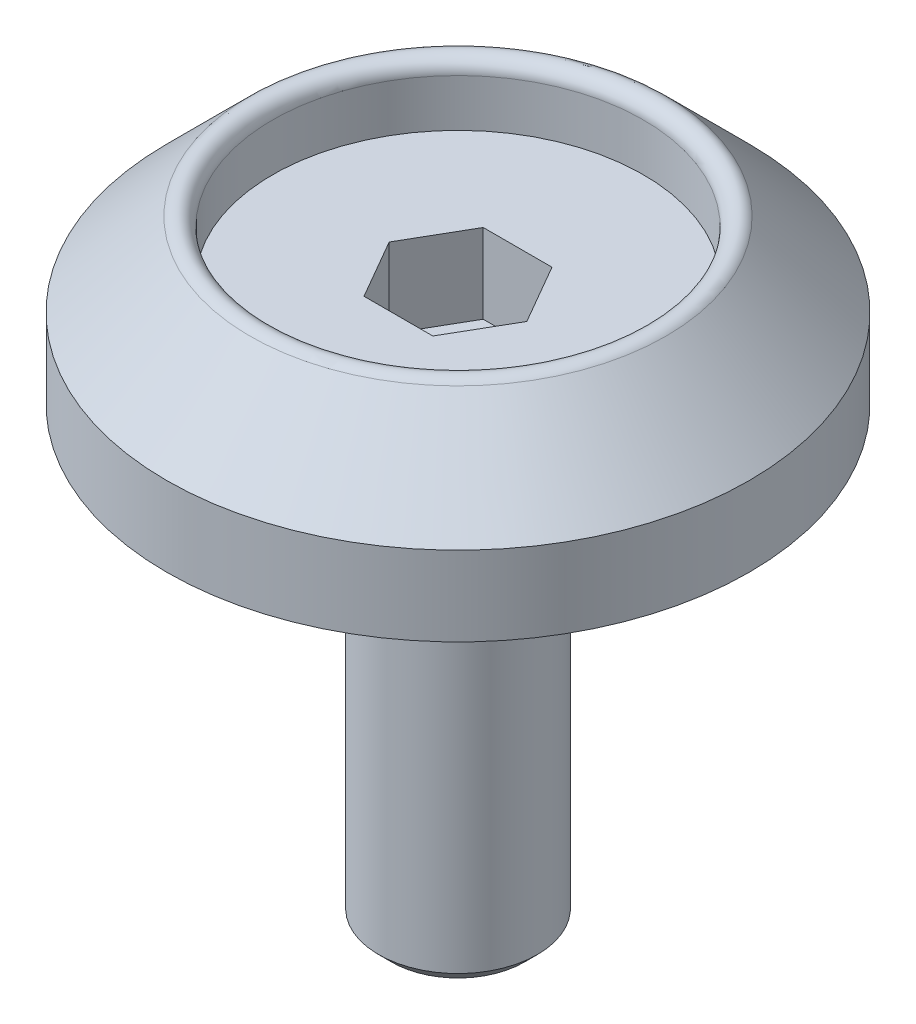
ISO-10303-21;
HEADER;
FILE_DESCRIPTION(('STEP AP214'),'2;1');
FILE_NAME('part.step','',(''),(''),'','','');
FILE_SCHEMA(('AUTOMOTIVE_DESIGN { 1 0 10303 214 1 1 1 1 }'));
ENDSEC;
DATA;
#1=APPLICATION_CONTEXT('core data for automotive mechanical design processes');
#2=APPLICATION_PROTOCOL_DEFINITION('international standard','automotive_design',2000,#1);
#3=PRODUCT_CONTEXT('',#1,'mechanical');
#4=PRODUCT('Part','Part','',(#3));
#5=PRODUCT_RELATED_PRODUCT_CATEGORY('part','',(#4));
#6=PRODUCT_DEFINITION_FORMATION('','',#4);
#7=PRODUCT_DEFINITION_CONTEXT('part definition',#1,'design');
#8=PRODUCT_DEFINITION('design','',#6,#7);
#9=PRODUCT_DEFINITION_SHAPE('','',#8);
#10=(LENGTH_UNIT() NAMED_UNIT(*) SI_UNIT(.MILLI.,.METRE.));
#11=(NAMED_UNIT(*) PLANE_ANGLE_UNIT() SI_UNIT($,.RADIAN.));
#12=(NAMED_UNIT(*) SI_UNIT($,.STERADIAN.) SOLID_ANGLE_UNIT());
#13=UNCERTAINTY_MEASURE_WITH_UNIT(LENGTH_MEASURE(1.E-05),#10,'distance_accuracy_value','');
#14=(GEOMETRIC_REPRESENTATION_CONTEXT(3) GLOBAL_UNCERTAINTY_ASSIGNED_CONTEXT((#13)) GLOBAL_UNIT_ASSIGNED_CONTEXT((#10,
#11,#12)) REPRESENTATION_CONTEXT('',''));
#15=CARTESIAN_POINT('',(0.,0.,0.));
#16=DIRECTION('',(0.,0.,1.));
#17=DIRECTION('',(1.,0.,0.));
#18=AXIS2_PLACEMENT_3D('',#15,#16,#17);
#19=CARTESIAN_POINT('',(0.,0.,0.));
#20=DIRECTION('',(0.,-1.,0.));
#21=DIRECTION('',(1.,0.,0.));
#22=AXIS2_PLACEMENT_3D('',#19,#20,#21);
#23=PLANE('',#22);
#24=CARTESIAN_POINT('',(0.,0.,0.));
#25=DIRECTION('',(0.,-1.,0.));
#26=DIRECTION('',(1.,0.,0.));
#27=AXIS2_PLACEMENT_3D('',#24,#25,#26);
#28=CIRCLE('',#27,1.25000000000002);
#29=CARTESIAN_POINT('',(1.25000000000001,0.,0.));
#30=VERTEX_POINT('',#29);
#31=EDGE_CURVE('E11',#30,#30,#28,.T.);
#32=ORIENTED_EDGE('',*,*,#31,.T.);
#33=EDGE_LOOP('',(#32));
#34=FACE_BOUND('',#33,.T.);
#35=ADVANCED_FACE('F32',(#34),#23,.T.);
#36=CARTESIAN_POINT('',(0.,0.,0.));
#37=DIRECTION('',(0.,1.,0.));
#38=DIRECTION('',(-1.,0.,0.));
#39=AXIS2_PLACEMENT_3D('',#36,#37,#38);
#40=CONICAL_SURFACE('',#39,1.25000000000002,0.785398163397451);
#41=CARTESIAN_POINT('',(0.,0.249999999999995,0.));
#42=DIRECTION('',(0.,-1.,0.));
#43=DIRECTION('',(1.,0.,0.));
#44=AXIS2_PLACEMENT_3D('',#41,#42,#43);
#45=CIRCLE('',#44,1.50000000000002);
#46=CARTESIAN_POINT('',(1.50000000000001,0.25,0.));
#47=VERTEX_POINT('',#46);
#48=EDGE_CURVE('E39',#47,#47,#45,.T.);
#49=ORIENTED_EDGE('',*,*,#48,.T.);
#50=EDGE_LOOP('',(#49));
#51=FACE_BOUND('',#50,.T.);
#52=ORIENTED_EDGE('',*,*,#31,.F.);
#53=EDGE_LOOP('',(#52));
#54=FACE_BOUND('',#53,.T.);
#55=ADVANCED_FACE('F160',(#51,#54),#40,.T.);
#56=CARTESIAN_POINT('',(0.,-3.12032212066735,0.));
#57=DIRECTION('',(0.,-1.,0.));
#58=DIRECTION('',(1.,0.,0.));
#59=AXIS2_PLACEMENT_3D('',#56,#57,#58);
#60=CYLINDRICAL_SURFACE('',#59,1.50000000000003);
#61=CARTESIAN_POINT('',(0.,8.49999999999999,0.));
#62=DIRECTION('',(0.,-1.,0.));
#63=DIRECTION('',(1.,0.,0.));
#64=AXIS2_PLACEMENT_3D('',#61,#62,#63);
#65=CIRCLE('',#64,1.50000000000005);
#66=CARTESIAN_POINT('',(1.5,8.5,0.));
#67=VERTEX_POINT('',#66);
#68=EDGE_CURVE('E155',#67,#67,#65,.T.);
#69=ORIENTED_EDGE('',*,*,#68,.T.);
#70=EDGE_LOOP('',(#69));
#71=FACE_BOUND('',#70,.T.);
#72=ORIENTED_EDGE('',*,*,#48,.F.);
#73=EDGE_LOOP('',(#72));
#74=FACE_BOUND('',#73,.T.);
#75=ADVANCED_FACE('F163',(#71,#74),#60,.T.);
#76=CARTESIAN_POINT('',(1.5,8.49999999999999,0.));
#77=DIRECTION('',(0.,-1.,0.));
#78=DIRECTION('',(1.,0.,0.));
#79=AXIS2_PLACEMENT_3D('',#76,#77,#78);
#80=PLANE('',#79);
#81=CARTESIAN_POINT('',(0.,8.49999999999998,0.));
#82=DIRECTION('',(0.,-1.,0.));
#83=DIRECTION('',(1.,0.,0.));
#84=AXIS2_PLACEMENT_3D('',#81,#82,#83);
#85=CIRCLE('',#84,5.50000000000004);
#86=CARTESIAN_POINT('',(5.5,8.5,0.));
#87=VERTEX_POINT('',#86);
#88=EDGE_CURVE('E152',#87,#87,#85,.T.);
#89=ORIENTED_EDGE('',*,*,#88,.T.);
#90=EDGE_LOOP('',(#89));
#91=FACE_BOUND('',#90,.T.);
#92=ORIENTED_EDGE('',*,*,#68,.F.);
#93=EDGE_LOOP('',(#92));
#94=FACE_BOUND('',#93,.T.);
#95=ADVANCED_FACE('F165',(#91,#94),#80,.T.);
#96=CARTESIAN_POINT('',(0.,-3.12032212066735,0.));
#97=DIRECTION('',(0.,-1.,0.));
#98=DIRECTION('',(1.,0.,0.));
#99=AXIS2_PLACEMENT_3D('',#96,#97,#98);
#100=CYLINDRICAL_SURFACE('',#99,5.50000000000005);
#101=CARTESIAN_POINT('',(0.,9.99999999999998,0.));
#102=DIRECTION('',(0.,-1.,0.));
#103=DIRECTION('',(1.,0.,0.));
#104=AXIS2_PLACEMENT_3D('',#101,#102,#103);
#105=CIRCLE('',#104,5.50000000000005);
#106=CARTESIAN_POINT('',(5.5,10.,0.));
#107=VERTEX_POINT('',#106);
#108=EDGE_CURVE('E149',#107,#107,#105,.T.);
#109=ORIENTED_EDGE('',*,*,#108,.T.);
#110=EDGE_LOOP('',(#109));
#111=FACE_BOUND('',#110,.T.);
#112=ORIENTED_EDGE('',*,*,#88,.F.);
#113=EDGE_LOOP('',(#112));
#114=FACE_BOUND('',#113,.T.);
#115=ADVANCED_FACE('F172',(#111,#114),#100,.T.);
#116=CARTESIAN_POINT('',(0.,9.99999999999998,0.));
#117=DIRECTION('',(0.,-1.,0.));
#118=DIRECTION('',(1.,0.,0.));
#119=AXIS2_PLACEMENT_3D('',#116,#117,#118);
#120=CONICAL_SURFACE('',#119,5.50000000000005,0.785398163397448);
#121=CARTESIAN_POINT('',(0.,11.5732233047033,0.));
#122=DIRECTION('',(0.,-1.,0.));
#123=DIRECTION('',(1.,0.,0.));
#124=AXIS2_PLACEMENT_3D('',#121,#122,#123);
#125=CIRCLE('',#124,3.92677669529669);
#126=CARTESIAN_POINT('',(3.92677669529663,11.5732233047034,0.));
#127=VERTEX_POINT('',#126);
#128=EDGE_CURVE('E146',#127,#127,#125,.T.);
#129=ORIENTED_EDGE('',*,*,#128,.T.);
#130=EDGE_LOOP('',(#129));
#131=FACE_BOUND('',#130,.T.);
#132=ORIENTED_EDGE('',*,*,#108,.F.);
#133=EDGE_LOOP('',(#132));
#134=FACE_BOUND('',#133,.T.);
#135=ADVANCED_FACE('F203',(#131,#134),#120,.T.);
#136=CARTESIAN_POINT('',(0.,11.3964466094067,0.));
#137=DIRECTION('',(0.,-1.,0.));
#138=DIRECTION('',(1.,0.,0.));
#139=AXIS2_PLACEMENT_3D('',#136,#137,#138);
#140=TOROIDAL_SURFACE('',#139,3.75000000000005,0.249999999999998);
#141=CARTESIAN_POINT('',(0.,11.3964466094067,0.));
#142=DIRECTION('',(0.,-1.,0.));
#143=DIRECTION('',(1.,0.,0.));
#144=AXIS2_PLACEMENT_3D('',#141,#142,#143);
#145=CIRCLE('',#144,3.50000000000006);
#146=CARTESIAN_POINT('',(3.5,11.3964466094067,0.));
#147=VERTEX_POINT('',#146);
#148=EDGE_CURVE('E143',#147,#147,#145,.T.);
#149=ORIENTED_EDGE('',*,*,#148,.T.);
#150=EDGE_LOOP('',(#149));
#151=FACE_BOUND('',#150,.T.);
#152=ORIENTED_EDGE('',*,*,#128,.F.);
#153=EDGE_LOOP('',(#152));
#154=FACE_BOUND('',#153,.T.);
#155=ADVANCED_FACE('F213',(#151,#154),#140,.T.);
#156=CARTESIAN_POINT('',(0.,-3.12032212066735,0.));
#157=DIRECTION('',(0.,-1.,0.));
#158=DIRECTION('',(1.,0.,0.));
#159=AXIS2_PLACEMENT_3D('',#156,#157,#158);
#160=CYLINDRICAL_SURFACE('',#159,3.50000000000005);
#161=CARTESIAN_POINT('',(0.,10.5,0.));
#162=DIRECTION('',(0.,-1.,0.));
#163=DIRECTION('',(1.,0.,0.));
#164=AXIS2_PLACEMENT_3D('',#161,#162,#163);
#165=CIRCLE('',#164,3.50000000000005);
#166=CARTESIAN_POINT('',(3.5,10.5,0.));
#167=VERTEX_POINT('',#166);
#168=EDGE_CURVE('E134',#167,#167,#165,.T.);
#169=ORIENTED_EDGE('',*,*,#168,.T.);
#170=EDGE_LOOP('',(#169));
#171=FACE_BOUND('',#170,.T.);
#172=ORIENTED_EDGE('',*,*,#148,.F.);
#173=EDGE_LOOP('',(#172));
#174=FACE_BOUND('',#173,.T.);
#175=ADVANCED_FACE('F223',(#171,#174),#160,.F.);
#176=CARTESIAN_POINT('',(0.,10.5,0.));
#177=DIRECTION('',(0.,1.,0.));
#178=DIRECTION('',(-1.,0.,0.));
#179=AXIS2_PLACEMENT_3D('',#176,#177,#178);
#180=PLANE('',#179);
#181=DIRECTION('',(0.499999999999998,0.,0.86602540378444));
#182=VECTOR('',#181,1.);
#183=CARTESIAN_POINT('',(-0.649519052838369,10.5,1.125));
#184=LINE('',#183,#182);
#185=CARTESIAN_POINT('',(-1.2990381056767,10.5,0.));
#186=VERTEX_POINT('',#185);
#187=CARTESIAN_POINT('',(-0.649519052838369,10.5,1.125));
#188=VERTEX_POINT('',#187);
#189=EDGE_CURVE('E46',#186,#188,#184,.T.);
#190=ORIENTED_EDGE('',*,*,#189,.F.);
#191=DIRECTION('',(-0.500000000000004,0.,0.866025403784436));
#192=VECTOR('',#191,1.);
#193=CARTESIAN_POINT('',(-1.2990381056767,10.5,0.));
#194=LINE('',#193,#192);
#195=CARTESIAN_POINT('',(-0.649519052838364,10.5,-1.125));
#196=VERTEX_POINT('',#195);
#197=EDGE_CURVE('E116',#196,#186,#194,.T.);
#198=ORIENTED_EDGE('',*,*,#197,.F.);
#199=DIRECTION('',(-1.,0.,0.));
#200=VECTOR('',#199,1.);
#201=CARTESIAN_POINT('',(-0.649519052838364,10.5,-1.125));
#202=LINE('',#201,#200);
#203=CARTESIAN_POINT('',(0.649519052838292,10.5,-1.125));
#204=VERTEX_POINT('',#203);
#205=EDGE_CURVE('E110',#204,#196,#202,.T.);
#206=ORIENTED_EDGE('',*,*,#205,.F.);
#207=DIRECTION('',(-0.499999999999998,0.,-0.86602540378444));
#208=VECTOR('',#207,1.);
#209=CARTESIAN_POINT('',(0.649519052838292,10.5,-1.125));
#210=LINE('',#209,#208);
#211=CARTESIAN_POINT('',(1.29903810567662,10.5,0.));
#212=VERTEX_POINT('',#211);
#213=EDGE_CURVE('E108',#212,#204,#210,.T.);
#214=ORIENTED_EDGE('',*,*,#213,.F.);
#215=DIRECTION('',(0.500000000000004,0.,-0.866025403784436));
#216=VECTOR('',#215,1.);
#217=CARTESIAN_POINT('',(1.29903810567662,10.5,0.));
#218=LINE('',#217,#216);
#219=CARTESIAN_POINT('',(0.649519052838287,10.5,1.125));
#220=VERTEX_POINT('',#219);
#221=EDGE_CURVE('E89',#220,#212,#218,.T.);
#222=ORIENTED_EDGE('',*,*,#221,.F.);
#223=DIRECTION('',(1.,0.,0.));
#224=VECTOR('',#223,1.);
#225=CARTESIAN_POINT('',(0.649519052838287,10.5,1.125));
#226=LINE('',#225,#224);
#227=EDGE_CURVE('E100',#188,#220,#226,.T.);
#228=ORIENTED_EDGE('',*,*,#227,.F.);
#229=EDGE_LOOP('',(#190,#198,#206,#214,#222,#228));
#230=FACE_BOUND('',#229,.T.);
#231=ORIENTED_EDGE('',*,*,#168,.F.);
#232=EDGE_LOOP('',(#231));
#233=FACE_BOUND('',#232,.T.);
#234=ADVANCED_FACE('F104',(#230,#233),#180,.T.);
#235=CARTESIAN_POINT('',(-0.649519052838364,8.99999999999999,1.125));
#236=DIRECTION('',(-0.86602540378444,0.,0.499999999999998));
#237=DIRECTION('',(0.499999999999998,0.,0.86602540378444));
#238=AXIS2_PLACEMENT_3D('',#235,#236,#237);
#239=PLANE('',#238);
#240=ORIENTED_EDGE('',*,*,#189,.T.);
#241=DIRECTION('',(0.,1.,0.));
#242=VECTOR('',#241,1.);
#243=CARTESIAN_POINT('',(-0.649519052838364,8.99999999999999,1.125));
#244=LINE('',#243,#242);
#245=CARTESIAN_POINT('',(-0.649519052838364,8.99999999999999,1.125));
#246=VERTEX_POINT('',#245);
#247=EDGE_CURVE('E97',#246,#188,#244,.T.);
#248=ORIENTED_EDGE('',*,*,#247,.F.);
#249=DIRECTION('',(0.499999999999998,0.,0.86602540378444));
#250=VECTOR('',#249,1.);
#251=CARTESIAN_POINT('',(-0.649519052838364,8.99999999999999,1.125));
#252=LINE('',#251,#250);
#253=CARTESIAN_POINT('',(-1.29903810567669,8.99999999999998,0.));
#254=VERTEX_POINT('',#253);
#255=EDGE_CURVE('E118',#254,#246,#252,.T.);
#256=ORIENTED_EDGE('',*,*,#255,.F.);
#257=DIRECTION('',(0.,1.,0.));
#258=VECTOR('',#257,1.);
#259=CARTESIAN_POINT('',(-1.29903810567669,8.99999999999998,0.));
#260=LINE('',#259,#258);
#261=EDGE_CURVE('E53',#254,#186,#260,.T.);
#262=ORIENTED_EDGE('',*,*,#261,.T.);
#263=EDGE_LOOP('',(#240,#248,#256,#262));
#264=FACE_BOUND('',#263,.T.);
#265=ADVANCED_FACE('F242',(#264),#239,.F.);
#266=CARTESIAN_POINT('',(-1.29903810567669,8.99999999999998,0.));
#267=DIRECTION('',(-0.866025403784436,0.,-0.500000000000004));
#268=DIRECTION('',(-0.500000000000004,0.,0.866025403784436));
#269=AXIS2_PLACEMENT_3D('',#266,#267,#268);
#270=PLANE('',#269);
#271=ORIENTED_EDGE('',*,*,#197,.T.);
#272=ORIENTED_EDGE('',*,*,#261,.F.);
#273=DIRECTION('',(-0.500000000000004,0.,0.866025403784436));
#274=VECTOR('',#273,1.);
#275=CARTESIAN_POINT('',(-1.29903810567669,8.99999999999998,0.));
#276=LINE('',#275,#274);
#277=CARTESIAN_POINT('',(-0.649519052838359,8.99999999999999,-1.125));
#278=VERTEX_POINT('',#277);
#279=EDGE_CURVE('E130',#278,#254,#276,.T.);
#280=ORIENTED_EDGE('',*,*,#279,.F.);
#281=DIRECTION('',(0.,1.,0.));
#282=VECTOR('',#281,1.);
#283=CARTESIAN_POINT('',(-0.649519052838359,8.99999999999999,-1.125));
#284=LINE('',#283,#282);
#285=EDGE_CURVE('E135',#278,#196,#284,.T.);
#286=ORIENTED_EDGE('',*,*,#285,.T.);
#287=EDGE_LOOP('',(#271,#272,#280,#286));
#288=FACE_BOUND('',#287,.T.);
#289=ADVANCED_FACE('F251',(#288),#270,.F.);
#290=CARTESIAN_POINT('',(-0.649519052838359,8.99999999999999,-1.125));
#291=DIRECTION('',(0.,0.,-1.));
#292=DIRECTION('',(-1.,0.,0.));
#293=AXIS2_PLACEMENT_3D('',#290,#291,#292);
#294=PLANE('',#293);
#295=ORIENTED_EDGE('',*,*,#205,.T.);
#296=ORIENTED_EDGE('',*,*,#285,.F.);
#297=DIRECTION('',(-1.,0.,0.));
#298=VECTOR('',#297,1.);
#299=CARTESIAN_POINT('',(-0.649519052838359,8.99999999999999,-1.125));
#300=LINE('',#299,#298);
#301=CARTESIAN_POINT('',(0.649519052838297,8.99999999999999,-1.125));
#302=VERTEX_POINT('',#301);
#303=EDGE_CURVE('E127',#302,#278,#300,.T.);
#304=ORIENTED_EDGE('',*,*,#303,.F.);
#305=DIRECTION('',(0.,1.,0.));
#306=VECTOR('',#305,1.);
#307=CARTESIAN_POINT('',(0.649519052838297,8.99999999999999,-1.125));
#308=LINE('',#307,#306);
#309=EDGE_CURVE('E137',#302,#204,#308,.T.);
#310=ORIENTED_EDGE('',*,*,#309,.T.);
#311=EDGE_LOOP('',(#295,#296,#304,#310));
#312=FACE_BOUND('',#311,.T.);
#313=ADVANCED_FACE('F260',(#312),#294,.F.);
#314=CARTESIAN_POINT('',(0.649519052838297,8.99999999999999,-1.125));
#315=DIRECTION('',(0.86602540378444,0.,-0.499999999999998));
#316=DIRECTION('',(-0.499999999999998,0.,-0.86602540378444));
#317=AXIS2_PLACEMENT_3D('',#314,#315,#316);
#318=PLANE('',#317);
#319=ORIENTED_EDGE('',*,*,#213,.T.);
#320=ORIENTED_EDGE('',*,*,#309,.F.);
#321=DIRECTION('',(-0.499999999999998,0.,-0.86602540378444));
#322=VECTOR('',#321,1.);
#323=CARTESIAN_POINT('',(0.649519052838297,8.99999999999999,-1.125));
#324=LINE('',#323,#322);
#325=CARTESIAN_POINT('',(1.29903810567663,8.99999999999999,0.));
#326=VERTEX_POINT('',#325);
#327=EDGE_CURVE('E124',#326,#302,#324,.T.);
#328=ORIENTED_EDGE('',*,*,#327,.F.);
#329=DIRECTION('',(0.,1.,0.));
#330=VECTOR('',#329,1.);
#331=CARTESIAN_POINT('',(1.29903810567663,8.99999999999999,0.));
#332=LINE('',#331,#330);
#333=EDGE_CURVE('E96',#326,#212,#332,.T.);
#334=ORIENTED_EDGE('',*,*,#333,.T.);
#335=EDGE_LOOP('',(#319,#320,#328,#334));
#336=FACE_BOUND('',#335,.T.);
#337=ADVANCED_FACE('F269',(#336),#318,.F.);
#338=CARTESIAN_POINT('',(1.29903810567663,8.99999999999999,0.));
#339=DIRECTION('',(0.866025403784436,0.,0.500000000000004));
#340=DIRECTION('',(0.500000000000004,0.,-0.866025403784436));
#341=AXIS2_PLACEMENT_3D('',#338,#339,#340);
#342=PLANE('',#341);
#343=ORIENTED_EDGE('',*,*,#221,.T.);
#344=ORIENTED_EDGE('',*,*,#333,.F.);
#345=DIRECTION('',(0.500000000000004,0.,-0.866025403784436));
#346=VECTOR('',#345,1.);
#347=CARTESIAN_POINT('',(1.29903810567663,8.99999999999999,0.));
#348=LINE('',#347,#346);
#349=CARTESIAN_POINT('',(0.649519052838292,8.99999999999999,1.125));
#350=VERTEX_POINT('',#349);
#351=EDGE_CURVE('E92',#350,#326,#348,.T.);
#352=ORIENTED_EDGE('',*,*,#351,.F.);
#353=DIRECTION('',(0.,1.,0.));
#354=VECTOR('',#353,1.);
#355=CARTESIAN_POINT('',(0.649519052838292,8.99999999999999,1.125));
#356=LINE('',#355,#354);
#357=EDGE_CURVE('E85',#350,#220,#356,.T.);
#358=ORIENTED_EDGE('',*,*,#357,.T.);
#359=EDGE_LOOP('',(#343,#344,#352,#358));
#360=FACE_BOUND('',#359,.T.);
#361=ADVANCED_FACE('F87',(#360),#342,.F.);
#362=CARTESIAN_POINT('',(0.649519052838292,8.99999999999999,1.125));
#363=DIRECTION('',(0.,0.,1.));
#364=DIRECTION('',(1.,0.,0.));
#365=AXIS2_PLACEMENT_3D('',#362,#363,#364);
#366=PLANE('',#365);
#367=ORIENTED_EDGE('',*,*,#227,.T.);
#368=ORIENTED_EDGE('',*,*,#357,.F.);
#369=DIRECTION('',(1.,0.,0.));
#370=VECTOR('',#369,1.);
#371=CARTESIAN_POINT('',(0.649519052838292,8.99999999999999,1.125));
#372=LINE('',#371,#370);
#373=EDGE_CURVE('E121',#246,#350,#372,.T.);
#374=ORIENTED_EDGE('',*,*,#373,.F.);
#375=ORIENTED_EDGE('',*,*,#247,.T.);
#376=EDGE_LOOP('',(#367,#368,#374,#375));
#377=FACE_BOUND('',#376,.T.);
#378=ADVANCED_FACE('F101',(#377),#366,.F.);
#379=CARTESIAN_POINT('',(-1.29903810567669,8.99999999999998,0.));
#380=DIRECTION('',(0.,-1.,0.));
#381=DIRECTION('',(1.,0.,0.));
#382=AXIS2_PLACEMENT_3D('',#379,#380,#381);
#383=PLANE('',#382);
#384=ORIENTED_EDGE('',*,*,#255,.T.);
#385=ORIENTED_EDGE('',*,*,#373,.T.);
#386=ORIENTED_EDGE('',*,*,#351,.T.);
#387=ORIENTED_EDGE('',*,*,#327,.T.);
#388=ORIENTED_EDGE('',*,*,#303,.T.);
#389=ORIENTED_EDGE('',*,*,#279,.T.);
#390=EDGE_LOOP('',(#384,#385,#386,#387,#388,#389));
#391=FACE_BOUND('',#390,.T.);
#392=ADVANCED_FACE('F296',(#391),#383,.F.);
#393=CLOSED_SHELL('',(#35,#55,#75,#95,#115,#135,#155,#175,#234,#265,#289,#313,#337,#361,#378,#392));
#394=MANIFOLD_SOLID_BREP('B2',#393);
#395=ADVANCED_BREP_SHAPE_REPRESENTATION('',(#18,#394),#14);
#396=SHAPE_DEFINITION_REPRESENTATION(#9,#395);
ENDSEC;
END-ISO-10303-21;
